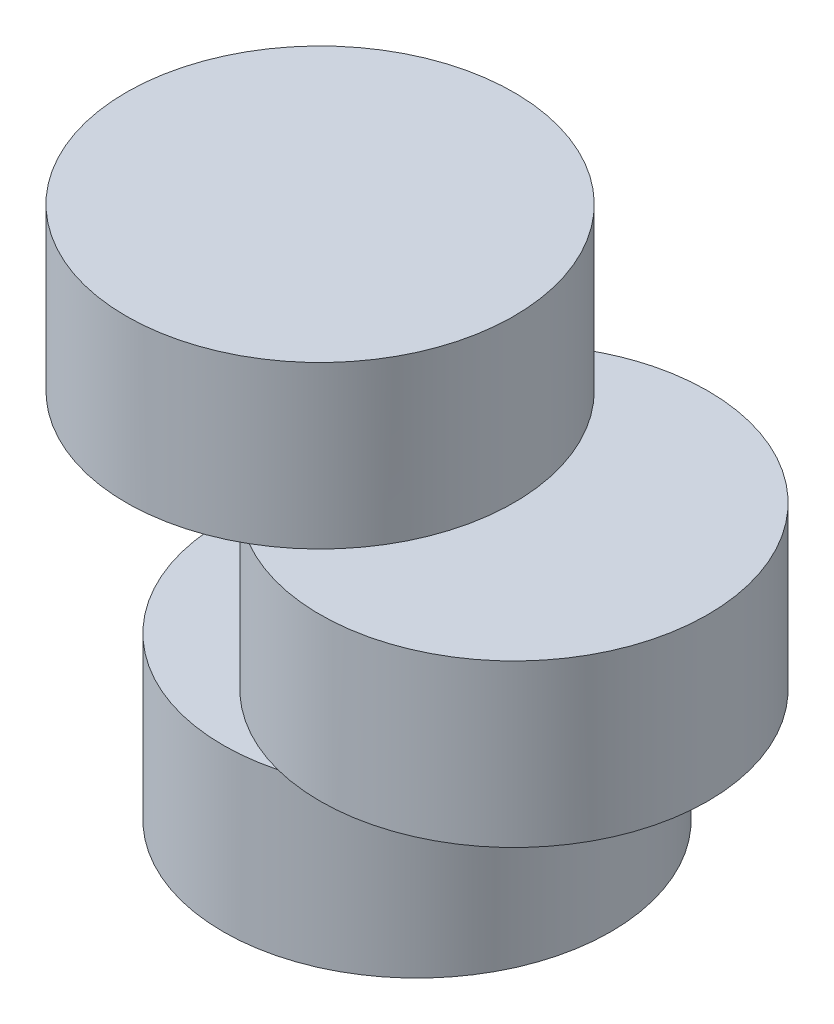
ISO-10303-21;
HEADER;
FILE_DESCRIPTION(('STEP AP214'),'2;1');
FILE_NAME('part.step','',(''),(''),'','','');
FILE_SCHEMA(('AUTOMOTIVE_DESIGN { 1 0 10303 214 1 1 1 1 }'));
ENDSEC;
DATA;
#1=APPLICATION_CONTEXT('core data for automotive mechanical design processes');
#2=APPLICATION_PROTOCOL_DEFINITION('international standard','automotive_design',2000,#1);
#3=PRODUCT_CONTEXT('',#1,'mechanical');
#4=PRODUCT('Part','Part','',(#3));
#5=PRODUCT_RELATED_PRODUCT_CATEGORY('part','',(#4));
#6=PRODUCT_DEFINITION_FORMATION('','',#4);
#7=PRODUCT_DEFINITION_CONTEXT('part definition',#1,'design');
#8=PRODUCT_DEFINITION('design','',#6,#7);
#9=PRODUCT_DEFINITION_SHAPE('','',#8);
#10=(LENGTH_UNIT() NAMED_UNIT(*) SI_UNIT(.MILLI.,.METRE.));
#11=(NAMED_UNIT(*) PLANE_ANGLE_UNIT() SI_UNIT($,.RADIAN.));
#12=(NAMED_UNIT(*) SI_UNIT($,.STERADIAN.) SOLID_ANGLE_UNIT());
#13=UNCERTAINTY_MEASURE_WITH_UNIT(LENGTH_MEASURE(1.E-05),#10,'distance_accuracy_value','');
#14=(GEOMETRIC_REPRESENTATION_CONTEXT(3) GLOBAL_UNCERTAINTY_ASSIGNED_CONTEXT((#13)) GLOBAL_UNIT_ASSIGNED_CONTEXT((#10,
#11,#12)) REPRESENTATION_CONTEXT('',''));
#15=CARTESIAN_POINT('',(0.,0.,0.));
#16=DIRECTION('',(0.,0.,1.));
#17=DIRECTION('',(1.,0.,0.));
#18=AXIS2_PLACEMENT_3D('',#15,#16,#17);
#19=CARTESIAN_POINT('',(0.,10.,0.));
#20=DIRECTION('',(0.,-1.,0.));
#21=DIRECTION('',(0.,0.,-1.));
#22=AXIS2_PLACEMENT_3D('',#19,#20,#21);
#23=CYLINDRICAL_SURFACE('',#22,12.);
#24=CARTESIAN_POINT('',(0.,10.,0.));
#25=DIRECTION('',(0.,1.,0.));
#26=DIRECTION('',(0.,0.,1.));
#27=AXIS2_PLACEMENT_3D('',#24,#25,#26);
#28=CIRCLE('',#27,12.);
#29=CARTESIAN_POINT('',(3.,10.,11.6189500386223));
#30=VERTEX_POINT('',#29);
#31=CARTESIAN_POINT('',(3.,10.,-11.6189500386223));
#32=VERTEX_POINT('',#31);
#33=EDGE_CURVE('E11',#30,#32,#28,.T.);
#34=ORIENTED_EDGE('',*,*,#33,.F.);
#35=EDGE_CURVE('E54',#32,#30,#28,.T.);
#36=ORIENTED_EDGE('',*,*,#35,.F.);
#37=EDGE_LOOP('',(#34,#36));
#38=FACE_BOUND('',#37,.T.);
#39=CARTESIAN_POINT('',(0.,0.,0.));
#40=DIRECTION('',(0.,1.,0.));
#41=DIRECTION('',(0.,0.,1.));
#42=AXIS2_PLACEMENT_3D('',#39,#40,#41);
#43=CIRCLE('',#42,12.);
#44=CARTESIAN_POINT('',(0.,0.,12.));
#45=VERTEX_POINT('',#44);
#46=EDGE_CURVE('E48',#45,#45,#43,.T.);
#47=ORIENTED_EDGE('',*,*,#46,.T.);
#48=EDGE_LOOP('',(#47));
#49=FACE_BOUND('',#48,.T.);
#50=ADVANCED_FACE('F45',(#38,#49),#23,.T.);
#51=CARTESIAN_POINT('',(0.,10.,0.));
#52=DIRECTION('',(0.,1.,0.));
#53=DIRECTION('',(0.,0.,1.));
#54=AXIS2_PLACEMENT_3D('',#51,#52,#53);
#55=PLANE('',#54);
#56=CARTESIAN_POINT('',(6.,10.,0.));
#57=DIRECTION('',(0.,1.,0.));
#58=DIRECTION('',(0.,0.,1.));
#59=AXIS2_PLACEMENT_3D('',#56,#57,#58);
#60=CIRCLE('',#59,12.);
#61=EDGE_CURVE('E127',#32,#30,#60,.T.);
#62=ORIENTED_EDGE('',*,*,#61,.F.);
#63=ORIENTED_EDGE('',*,*,#35,.T.);
#64=EDGE_LOOP('',(#62,#63));
#65=FACE_BOUND('',#64,.T.);
#66=ADVANCED_FACE('F143',(#65),#55,.T.);
#67=CARTESIAN_POINT('',(0.,0.,0.));
#68=DIRECTION('',(0.,1.,0.));
#69=DIRECTION('',(0.,0.,1.));
#70=AXIS2_PLACEMENT_3D('',#67,#68,#69);
#71=PLANE('',#70);
#72=DIRECTION('',(0.,0.,-1.));
#73=VECTOR('',#72,1.);
#74=CARTESIAN_POINT('',(-2.18011496700022,0.,-2.06084903150659));
#75=LINE('',#74,#73);
#76=CARTESIAN_POINT('',(-2.18011496700022,0.,2.06084903150659));
#77=VERTEX_POINT('',#76);
#78=CARTESIAN_POINT('',(-2.18011496700022,0.,-2.06084903150659));
#79=VERTEX_POINT('',#78);
#80=EDGE_CURVE('E102',#77,#79,#75,.T.);
#81=ORIENTED_EDGE('',*,*,#80,.F.);
#82=CARTESIAN_POINT('',(0.,0.,0.));
#83=DIRECTION('',(0.,-1.,0.));
#84=DIRECTION('',(0.,0.,-1.));
#85=AXIS2_PLACEMENT_3D('',#82,#83,#84);
#86=CIRCLE('',#85,3.);
#87=EDGE_CURVE('E61',#79,#77,#86,.T.);
#88=ORIENTED_EDGE('',*,*,#87,.F.);
#89=EDGE_LOOP('',(#81,#88));
#90=FACE_BOUND('',#89,.T.);
#91=ORIENTED_EDGE('',*,*,#46,.F.);
#92=EDGE_LOOP('',(#91));
#93=FACE_BOUND('',#92,.T.);
#94=ADVANCED_FACE('F149',(#90,#93),#71,.F.);
#95=CARTESIAN_POINT('',(6.,10.,0.));
#96=DIRECTION('',(0.,1.,0.));
#97=DIRECTION('',(0.,0.,1.));
#98=AXIS2_PLACEMENT_3D('',#95,#96,#97);
#99=PLANE('',#98);
#100=EDGE_CURVE('E119',#30,#32,#60,.T.);
#101=ORIENTED_EDGE('',*,*,#100,.F.);
#102=ORIENTED_EDGE('',*,*,#33,.T.);
#103=EDGE_LOOP('',(#101,#102));
#104=FACE_BOUND('',#103,.T.);
#105=ADVANCED_FACE('F137',(#104),#99,.F.);
#106=CARTESIAN_POINT('',(6.,20.,0.));
#107=DIRECTION('',(0.,-1.,0.));
#108=DIRECTION('',(0.,0.,-1.));
#109=AXIS2_PLACEMENT_3D('',#106,#107,#108);
#110=CYLINDRICAL_SURFACE('',#109,12.);
#111=CARTESIAN_POINT('',(6.,20.,0.));
#112=DIRECTION('',(0.,1.,0.));
#113=DIRECTION('',(0.,0.,1.));
#114=AXIS2_PLACEMENT_3D('',#111,#112,#113);
#115=CIRCLE('',#114,12.);
#116=CARTESIAN_POINT('',(0.,20.,-10.3923048454133));
#117=VERTEX_POINT('',#116);
#118=CARTESIAN_POINT('',(0.,20.,10.3923048454133));
#119=VERTEX_POINT('',#118);
#120=EDGE_CURVE('E122',#117,#119,#115,.T.);
#121=ORIENTED_EDGE('',*,*,#120,.F.);
#122=EDGE_CURVE('E126',#119,#117,#115,.T.);
#123=ORIENTED_EDGE('',*,*,#122,.F.);
#124=EDGE_LOOP('',(#121,#123));
#125=FACE_BOUND('',#124,.T.);
#126=ORIENTED_EDGE('',*,*,#61,.T.);
#127=ORIENTED_EDGE('',*,*,#100,.T.);
#128=EDGE_LOOP('',(#126,#127));
#129=FACE_BOUND('',#128,.T.);
#130=ADVANCED_FACE('F135',(#125,#129),#110,.T.);
#131=CARTESIAN_POINT('',(6.,20.,0.));
#132=DIRECTION('',(0.,1.,0.));
#133=DIRECTION('',(0.,0.,1.));
#134=AXIS2_PLACEMENT_3D('',#131,#132,#133);
#135=PLANE('',#134);
#136=CARTESIAN_POINT('',(-6.,20.,0.));
#137=DIRECTION('',(0.,1.,0.));
#138=DIRECTION('',(0.,0.,1.));
#139=AXIS2_PLACEMENT_3D('',#136,#137,#138);
#140=CIRCLE('',#139,12.);
#141=EDGE_CURVE('E68',#119,#117,#140,.T.);
#142=ORIENTED_EDGE('',*,*,#141,.F.);
#143=ORIENTED_EDGE('',*,*,#122,.T.);
#144=EDGE_LOOP('',(#142,#143));
#145=FACE_BOUND('',#144,.T.);
#146=ADVANCED_FACE('F183',(#145),#135,.T.);
#147=CARTESIAN_POINT('',(0.,20.,0.));
#148=DIRECTION('',(0.,1.,0.));
#149=DIRECTION('',(0.,0.,1.));
#150=AXIS2_PLACEMENT_3D('',#147,#148,#149);
#151=PLANE('',#150);
#152=EDGE_CURVE('E113',#117,#119,#140,.T.);
#153=ORIENTED_EDGE('',*,*,#152,.F.);
#154=ORIENTED_EDGE('',*,*,#120,.T.);
#155=EDGE_LOOP('',(#153,#154));
#156=FACE_BOUND('',#155,.T.);
#157=ADVANCED_FACE('F194',(#156),#151,.F.);
#158=CARTESIAN_POINT('',(-6.,30.,0.));
#159=DIRECTION('',(0.,-1.,0.));
#160=DIRECTION('',(0.,0.,-1.));
#161=AXIS2_PLACEMENT_3D('',#158,#159,#160);
#162=CYLINDRICAL_SURFACE('',#161,12.);
#163=CARTESIAN_POINT('',(-6.,30.,0.));
#164=DIRECTION('',(0.,1.,0.));
#165=DIRECTION('',(0.,0.,1.));
#166=AXIS2_PLACEMENT_3D('',#163,#164,#165);
#167=CIRCLE('',#166,12.);
#168=CARTESIAN_POINT('',(-6.,30.,12.));
#169=VERTEX_POINT('',#168);
#170=EDGE_CURVE('E115',#169,#169,#167,.T.);
#171=ORIENTED_EDGE('',*,*,#170,.F.);
#172=EDGE_LOOP('',(#171));
#173=FACE_BOUND('',#172,.T.);
#174=ORIENTED_EDGE('',*,*,#141,.T.);
#175=ORIENTED_EDGE('',*,*,#152,.T.);
#176=EDGE_LOOP('',(#174,#175));
#177=FACE_BOUND('',#176,.T.);
#178=ADVANCED_FACE('F205',(#173,#177),#162,.T.);
#179=CARTESIAN_POINT('',(0.,30.,0.));
#180=DIRECTION('',(0.,1.,0.));
#181=DIRECTION('',(0.,0.,1.));
#182=AXIS2_PLACEMENT_3D('',#179,#180,#181);
#183=PLANE('',#182);
#184=ORIENTED_EDGE('',*,*,#170,.T.);
#185=EDGE_LOOP('',(#184));
#186=FACE_BOUND('',#185,.T.);
#187=ADVANCED_FACE('F215',(#186),#183,.T.);
#188=CARTESIAN_POINT('',(0.,6.,0.));
#189=DIRECTION('',(0.,-1.,0.));
#190=DIRECTION('',(0.,0.,-1.));
#191=AXIS2_PLACEMENT_3D('',#188,#189,#190);
#192=CYLINDRICAL_SURFACE('',#191,3.);
#193=ORIENTED_EDGE('',*,*,#87,.T.);
#194=DIRECTION('',(0.,-1.,0.));
#195=VECTOR('',#194,1.);
#196=CARTESIAN_POINT('',(-2.18011496700022,6.,2.06084903150659));
#197=LINE('',#196,#195);
#198=CARTESIAN_POINT('',(-2.18011496700022,6.,2.06084903150659));
#199=VERTEX_POINT('',#198);
#200=EDGE_CURVE('E86',#199,#77,#197,.T.);
#201=ORIENTED_EDGE('',*,*,#200,.F.);
#202=CARTESIAN_POINT('',(0.,6.,0.));
#203=DIRECTION('',(0.,-1.,0.));
#204=DIRECTION('',(0.,0.,-1.));
#205=AXIS2_PLACEMENT_3D('',#202,#203,#204);
#206=CIRCLE('',#205,3.);
#207=CARTESIAN_POINT('',(-2.18011496700022,6.,-2.06084903150659));
#208=VERTEX_POINT('',#207);
#209=EDGE_CURVE('E89',#208,#199,#206,.T.);
#210=ORIENTED_EDGE('',*,*,#209,.F.);
#211=DIRECTION('',(0.,-1.,0.));
#212=VECTOR('',#211,1.);
#213=CARTESIAN_POINT('',(-2.18011496700022,6.,-2.06084903150659));
#214=LINE('',#213,#212);
#215=EDGE_CURVE('E96',#208,#79,#214,.T.);
#216=ORIENTED_EDGE('',*,*,#215,.T.);
#217=EDGE_LOOP('',(#193,#201,#210,#216));
#218=FACE_BOUND('',#217,.T.);
#219=ADVANCED_FACE('F88',(#218),#192,.F.);
#220=CARTESIAN_POINT('',(-2.18011496700022,6.,-2.06084903150659));
#221=DIRECTION('',(-1.,0.,0.));
#222=DIRECTION('',(0.,0.,1.));
#223=AXIS2_PLACEMENT_3D('',#220,#221,#222);
#224=PLANE('',#223);
#225=ORIENTED_EDGE('',*,*,#80,.T.);
#226=ORIENTED_EDGE('',*,*,#215,.F.);
#227=DIRECTION('',(0.,0.,-1.));
#228=VECTOR('',#227,1.);
#229=CARTESIAN_POINT('',(-2.18011496700022,6.,-2.06084903150659));
#230=LINE('',#229,#228);
#231=EDGE_CURVE('E97',#199,#208,#230,.T.);
#232=ORIENTED_EDGE('',*,*,#231,.F.);
#233=ORIENTED_EDGE('',*,*,#200,.T.);
#234=EDGE_LOOP('',(#225,#226,#232,#233));
#235=FACE_BOUND('',#234,.T.);
#236=ADVANCED_FACE('F104',(#235),#224,.F.);
#237=CARTESIAN_POINT('',(0.,6.,0.));
#238=DIRECTION('',(0.,-1.,0.));
#239=DIRECTION('',(0.,0.,-1.));
#240=AXIS2_PLACEMENT_3D('',#237,#238,#239);
#241=PLANE('',#240);
#242=ORIENTED_EDGE('',*,*,#209,.T.);
#243=ORIENTED_EDGE('',*,*,#231,.T.);
#244=EDGE_LOOP('',(#242,#243));
#245=FACE_BOUND('',#244,.T.);
#246=ADVANCED_FACE('F100',(#245),#241,.T.);
#247=CLOSED_SHELL('',(#50,#66,#94,#105,#130,#146,#157,#178,#187,#219,#236,#246));
#248=MANIFOLD_SOLID_BREP('B2',#247);
#249=ADVANCED_BREP_SHAPE_REPRESENTATION('',(#18,#248),#14);
#250=SHAPE_DEFINITION_REPRESENTATION(#9,#249);
ENDSEC;
END-ISO-10303-21;
